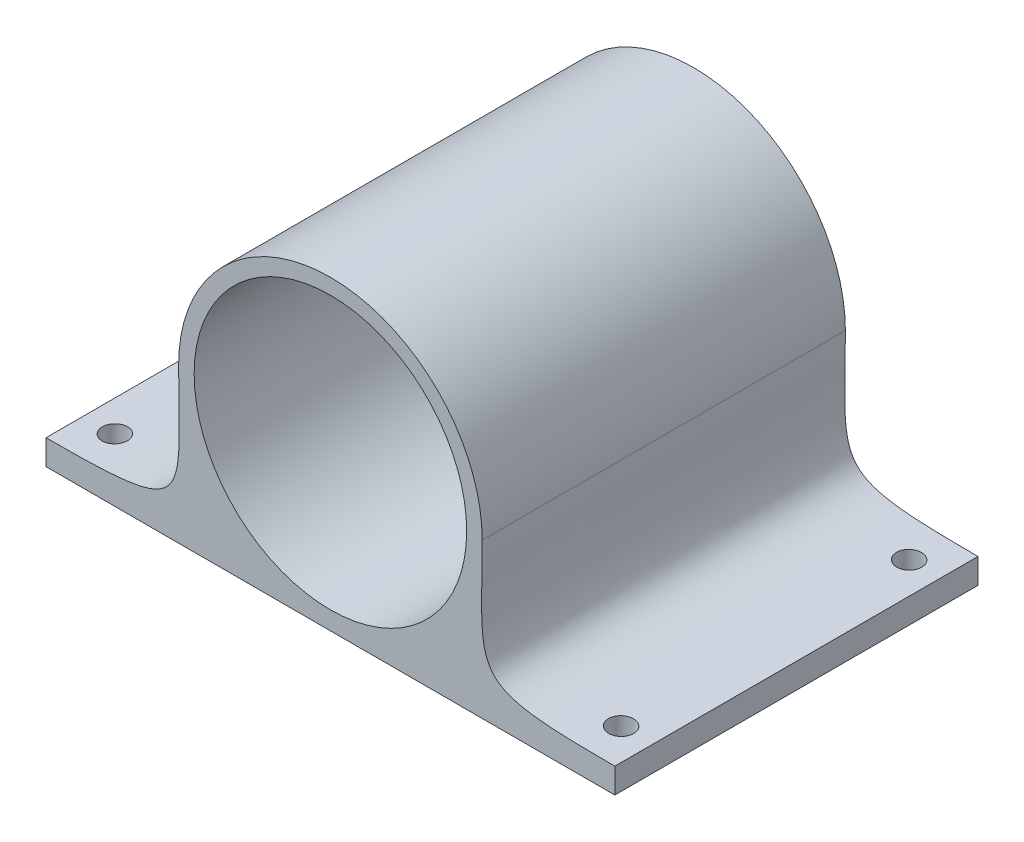
ISO-10303-21;
HEADER;
FILE_DESCRIPTION(('STEP AP214'),'2;1');
FILE_NAME('part.step','',(''),(''),'','','');
FILE_SCHEMA(('AUTOMOTIVE_DESIGN { 1 0 10303 214 1 1 1 1 }'));
ENDSEC;
DATA;
#1=APPLICATION_CONTEXT('core data for automotive mechanical design processes');
#2=APPLICATION_PROTOCOL_DEFINITION('international standard','automotive_design',2000,#1);
#3=PRODUCT_CONTEXT('',#1,'mechanical');
#4=PRODUCT('Part','Part','',(#3));
#5=PRODUCT_RELATED_PRODUCT_CATEGORY('part','',(#4));
#6=PRODUCT_DEFINITION_FORMATION('','',#4);
#7=PRODUCT_DEFINITION_CONTEXT('part definition',#1,'design');
#8=PRODUCT_DEFINITION('design','',#6,#7);
#9=PRODUCT_DEFINITION_SHAPE('','',#8);
#10=(LENGTH_UNIT() NAMED_UNIT(*) SI_UNIT(.MILLI.,.METRE.));
#11=(NAMED_UNIT(*) PLANE_ANGLE_UNIT() SI_UNIT($,.RADIAN.));
#12=(NAMED_UNIT(*) SI_UNIT($,.STERADIAN.) SOLID_ANGLE_UNIT());
#13=UNCERTAINTY_MEASURE_WITH_UNIT(LENGTH_MEASURE(1.E-05),#10,'distance_accuracy_value','');
#14=(GEOMETRIC_REPRESENTATION_CONTEXT(3) GLOBAL_UNCERTAINTY_ASSIGNED_CONTEXT((#13)) GLOBAL_UNIT_ASSIGNED_CONTEXT((#10,
#11,#12)) REPRESENTATION_CONTEXT('',''));
#15=CARTESIAN_POINT('',(0.,0.,0.));
#16=DIRECTION('',(0.,0.,1.));
#17=DIRECTION('',(1.,0.,0.));
#18=AXIS2_PLACEMENT_3D('',#15,#16,#17);
#19=CARTESIAN_POINT('',(0.,-24.6662459211709,58.));
#20=DIRECTION('',(0.,1.,0.));
#21=DIRECTION('',(0.,0.,1.));
#22=AXIS2_PLACEMENT_3D('',#19,#20,#21);
#23=PLANE('',#22);
#24=CARTESIAN_POINT('',(-40.4219408276064,-24.6662459211709,6.));
#25=DIRECTION('',(0.,1.,0.));
#26=DIRECTION('',(0.,0.,1.));
#27=AXIS2_PLACEMENT_3D('',#24,#25,#26);
#28=CIRCLE('',#27,2.);
#29=CARTESIAN_POINT('',(-40.4219408276064,-24.6662459211709,8.));
#30=VERTEX_POINT('',#29);
#31=EDGE_CURVE('E152',#30,#30,#28,.T.);
#32=ORIENTED_EDGE('',*,*,#31,.T.);
#33=EDGE_LOOP('',(#32));
#34=FACE_BOUND('',#33,.T.);
#35=CARTESIAN_POINT('',(40.4219408276064,-24.6662459211709,5.99999999999999));
#36=DIRECTION('',(0.,1.,0.));
#37=DIRECTION('',(0.,0.,1.));
#38=AXIS2_PLACEMENT_3D('',#35,#36,#37);
#39=CIRCLE('',#38,2.);
#40=CARTESIAN_POINT('',(40.4219408276064,-24.6662459211709,7.99999999999999));
#41=VERTEX_POINT('',#40);
#42=EDGE_CURVE('E149',#41,#41,#39,.F.);
#43=ORIENTED_EDGE('',*,*,#42,.F.);
#44=EDGE_LOOP('',(#43));
#45=FACE_BOUND('',#44,.T.);
#46=DIRECTION('',(1.,0.,0.));
#47=VECTOR('',#46,1.);
#48=CARTESIAN_POINT('',(0.,-24.6662459211709,0.));
#49=LINE('',#48,#47);
#50=CARTESIAN_POINT('',(-45.4219408276064,-24.6662459211709,0.));
#51=VERTEX_POINT('',#50);
#52=CARTESIAN_POINT('',(45.4219408276064,-24.6662459211709,0.));
#53=VERTEX_POINT('',#52);
#54=EDGE_CURVE('E112',#51,#53,#49,.T.);
#55=ORIENTED_EDGE('',*,*,#54,.T.);
#56=DIRECTION('',(0.,0.,-1.));
#57=VECTOR('',#56,1.);
#58=CARTESIAN_POINT('',(45.4219408276064,-24.6662459211709,58.));
#59=LINE('',#58,#57);
#60=CARTESIAN_POINT('',(45.4219408276064,-24.6662459211709,58.));
#61=VERTEX_POINT('',#60);
#62=EDGE_CURVE('E109',#61,#53,#59,.T.);
#63=ORIENTED_EDGE('',*,*,#62,.F.);
#64=DIRECTION('',(1.,0.,0.));
#65=VECTOR('',#64,1.);
#66=CARTESIAN_POINT('',(0.,-24.6662459211709,58.));
#67=LINE('',#66,#65);
#68=CARTESIAN_POINT('',(-45.4219408276064,-24.6662459211709,58.));
#69=VERTEX_POINT('',#68);
#70=EDGE_CURVE('E97',#69,#61,#67,.T.);
#71=ORIENTED_EDGE('',*,*,#70,.F.);
#72=DIRECTION('',(0.,0.,-1.));
#73=VECTOR('',#72,1.);
#74=CARTESIAN_POINT('',(-45.4219408276064,-24.6662459211709,58.));
#75=LINE('',#74,#73);
#76=EDGE_CURVE('E116',#69,#51,#75,.T.);
#77=ORIENTED_EDGE('',*,*,#76,.T.);
#78=EDGE_LOOP('',(#55,#63,#71,#77));
#79=FACE_BOUND('',#78,.T.);
#80=CARTESIAN_POINT('',(40.4219408276064,-24.6662459211709,52.));
#81=DIRECTION('',(0.,1.,0.));
#82=DIRECTION('',(0.,0.,1.));
#83=AXIS2_PLACEMENT_3D('',#80,#81,#82);
#84=CIRCLE('',#83,2.00601487558207);
#85=CARTESIAN_POINT('',(40.4219408276064,-24.6662459211709,54.0060148755821));
#86=VERTEX_POINT('',#85);
#87=EDGE_CURVE('E150',#86,#86,#84,.F.);
#88=ORIENTED_EDGE('',*,*,#87,.F.);
#89=EDGE_LOOP('',(#88));
#90=FACE_BOUND('',#89,.T.);
#91=CARTESIAN_POINT('',(-40.4219408276064,-24.6662459211709,52.));
#92=DIRECTION('',(0.,1.,0.));
#93=DIRECTION('',(0.,0.,1.));
#94=AXIS2_PLACEMENT_3D('',#91,#92,#93);
#95=CIRCLE('',#94,2.00601487558207);
#96=CARTESIAN_POINT('',(-40.4219408276064,-24.6662459211709,54.0060148755821));
#97=VERTEX_POINT('',#96);
#98=EDGE_CURVE('E222',#97,#97,#95,.T.);
#99=ORIENTED_EDGE('',*,*,#98,.T.);
#100=EDGE_LOOP('',(#99));
#101=FACE_BOUND('',#100,.T.);
#102=ADVANCED_FACE('F34',(#34,#45,#79,#90,#101),#23,.F.);
#103=CARTESIAN_POINT('',(45.4219408276064,-20.6662459211709,58.));
#104=CARTESIAN_POINT('',(21.5322033053492,-20.6662459211709,58.));
#105=CARTESIAN_POINT('',(24.2414756663066,-19.078845963853,58.));
#106=CARTESIAN_POINT('',(24.2414756663067,0.,58.));
#107=B_SPLINE_CURVE_WITH_KNOTS('',3,(#103,#104,#105,#106),.UNSPECIFIED.,.F.,.F.,(4,4),(0.,1.),.UNSPECIFIED.);
#108=DIRECTION('',(0.,0.,-1.));
#109=VECTOR('',#108,1.);
#110=SURFACE_OF_LINEAR_EXTRUSION('',#107,#109);
#111=CARTESIAN_POINT('',(45.4219408276064,-20.6662459211709,0.));
#112=CARTESIAN_POINT('',(21.5322033053492,-20.6662459211709,0.));
#113=CARTESIAN_POINT('',(24.2414756663066,-19.078845963853,0.));
#114=CARTESIAN_POINT('',(24.2414756663067,0.,0.));
#115=B_SPLINE_CURVE_WITH_KNOTS('',3,(#111,#112,#113,#114),.UNSPECIFIED.,.F.,.F.,(4,4),(0.,1.),.UNSPECIFIED.);
#116=CARTESIAN_POINT('',(45.4219408276064,-20.6662459211709,0.));
#117=VERTEX_POINT('',#116);
#118=CARTESIAN_POINT('',(24.2414756663067,0.,0.));
#119=VERTEX_POINT('',#118);
#120=EDGE_CURVE('E82',#117,#119,#115,.T.);
#121=ORIENTED_EDGE('',*,*,#120,.T.);
#122=DIRECTION('',(0.,0.,-1.));
#123=VECTOR('',#122,1.);
#124=CARTESIAN_POINT('',(24.2414756663067,0.,58.));
#125=LINE('',#124,#123);
#126=CARTESIAN_POINT('',(24.2414756663067,0.,58.));
#127=VERTEX_POINT('',#126);
#128=EDGE_CURVE('E120',#127,#119,#125,.T.);
#129=ORIENTED_EDGE('',*,*,#128,.F.);
#130=CARTESIAN_POINT('',(45.4219408276064,-20.6662459211709,58.));
#131=VERTEX_POINT('',#130);
#132=EDGE_CURVE('E57',#131,#127,#107,.T.);
#133=ORIENTED_EDGE('',*,*,#132,.F.);
#134=DIRECTION('',(0.,0.,-1.));
#135=VECTOR('',#134,1.);
#136=CARTESIAN_POINT('',(45.4219408276064,-20.6662459211709,58.));
#137=LINE('',#136,#135);
#138=EDGE_CURVE('E79',#131,#117,#137,.T.);
#139=ORIENTED_EDGE('',*,*,#138,.T.);
#140=EDGE_LOOP('',(#121,#129,#133,#139));
#141=FACE_BOUND('',#140,.T.);
#142=CARTESIAN_POINT('',(40.4219408276064,-20.6317382856228,7.99999999999999));
#143=CARTESIAN_POINT('',(40.5342790349699,-20.6336086290803,7.99999502249111));
#144=CARTESIAN_POINT('',(40.6467002286099,-20.6353787270249,7.9905033605227));
#145=CARTESIAN_POINT('',(40.8684496370192,-20.6386876994522,7.95276927023828));
#146=CARTESIAN_POINT('',(40.9777739744957,-20.6402262936494,7.92450433333279));
#147=CARTESIAN_POINT('',(41.1900849074258,-20.6430602528769,7.85002667215358));
#148=CARTESIAN_POINT('',(41.2930744666828,-20.6443557322422,7.80382241614786));
#149=CARTESIAN_POINT('',(41.4898073349953,-20.6467083637546,7.69478851274403));
#150=CARTESIAN_POINT('',(41.5835529305602,-20.6477655749213,7.6319629908748));
#151=CARTESIAN_POINT('',(41.7591709398412,-20.649656334208,7.49146262590645));
#152=CARTESIAN_POINT('',(41.8410430633063,-20.6504898768608,7.41378741990929));
#153=CARTESIAN_POINT('',(41.9905882271936,-20.6519523214478,7.24579001210443));
#154=CARTESIAN_POINT('',(42.0582607156949,-20.6525812154281,7.15546731893323));
#155=CARTESIAN_POINT('',(42.1774768853148,-20.6536541263953,6.96474805763309));
#156=CARTESIAN_POINT('',(42.2290216698837,-20.6540981560312,6.8643521793279));
#157=CARTESIAN_POINT('',(42.3145249670873,-20.6548187069021,6.65633155595461));
#158=CARTESIAN_POINT('',(42.3484835166343,-20.6550952284888,6.54870682605987));
#159=CARTESIAN_POINT('',(42.3978499833641,-20.6554931082411,6.32928497295178));
#160=CARTESIAN_POINT('',(42.4132581390924,-20.6556144684019,6.21748790341096));
#161=CARTESIAN_POINT('',(42.4250871230456,-20.6557078641429,5.99289387562374));
#162=CARTESIAN_POINT('',(42.4215079858603,-20.655679899995,5.88009691919925));
#163=CARTESIAN_POINT('',(42.3954641162226,-20.6554732807726,5.65670517386504));
#164=CARTESIAN_POINT('',(42.37299942895,-20.6552946260586,5.54611037968777));
#165=CARTESIAN_POINT('',(42.3098223167248,-20.6547782175756,5.33026202104121));
#166=CARTESIAN_POINT('',(42.2691098730028,-20.6544404636428,5.22500846206597));
#167=CARTESIAN_POINT('',(42.1705931746239,-20.6535914157975,5.02283043978747));
#168=CARTESIAN_POINT('',(42.1127889086491,-20.6530801217701,4.92590598199969));
#169=CARTESIAN_POINT('',(41.981729925504,-20.651865402409,4.74313757677469));
#170=CARTESIAN_POINT('',(41.9084752151785,-20.6511619771605,4.65729362442869));
#171=CARTESIAN_POINT('',(41.7485947447748,-20.6495430160419,4.49912209476095));
#172=CARTESIAN_POINT('',(41.6619688736682,-20.6486274784106,4.42679462968532));
#173=CARTESIAN_POINT('',(41.4778063385321,-20.6465665700805,4.29770956433603));
#174=CARTESIAN_POINT('',(41.380269672844,-20.6454211993468,4.2409519664293));
#175=CARTESIAN_POINT('',(41.1770517526185,-20.6428894606081,4.14461527672764));
#176=CARTESIAN_POINT('',(41.0713702332482,-20.6415030847649,4.10503674379422));
#177=CARTESIAN_POINT('',(40.8548660055108,-20.6384896405975,4.04418300338992));
#178=CARTESIAN_POINT('',(40.7440432956723,-20.6368625722045,4.02290780115779));
#179=CARTESIAN_POINT('',(40.5203929225547,-20.6333840409432,3.99926190336419));
#180=CARTESIAN_POINT('',(40.407565086996,-20.6315325587131,3.9968928401591));
#181=CARTESIAN_POINT('',(40.1831161659412,-20.627641998031,4.01112900906305));
#182=CARTESIAN_POINT('',(40.0714950815904,-20.6256029194011,4.02773425917967));
#183=CARTESIAN_POINT('',(39.8526107215316,-20.6213963024097,4.07945025814166));
#184=CARTESIAN_POINT('',(39.7453480880716,-20.6192287452309,4.11456372372603));
#185=CARTESIAN_POINT('',(39.5382414871035,-20.6148478054737,4.20230057079528));
#186=CARTESIAN_POINT('',(39.4383975269135,-20.6126344228501,4.25492396955209));
#187=CARTESIAN_POINT('',(39.2489494121442,-20.6082638150437,4.37619520468291));
#188=CARTESIAN_POINT('',(39.1593465231056,-20.6061065968268,4.44484501833901));
#189=CARTESIAN_POINT('',(38.9929383049359,-20.6019643026561,4.59621826047856));
#190=CARTESIAN_POINT('',(38.916132980814,-20.5999792267696,4.67894169447051));
#191=CARTESIAN_POINT('',(38.7775064428388,-20.5963007294066,4.85610924265601));
#192=CARTESIAN_POINT('',(38.7156841760157,-20.5946072874371,4.95055253250324));
#193=CARTESIAN_POINT('',(38.6087744471177,-20.5916229204034,5.14848415347149));
#194=CARTESIAN_POINT('',(38.563686934008,-20.5903319941116,5.25197245700733));
#195=CARTESIAN_POINT('',(38.4915416077108,-20.5882430719071,5.46502029945219));
#196=CARTESIAN_POINT('',(38.4644778618602,-20.5874449138022,5.57457782775432));
#197=CARTESIAN_POINT('',(38.4291267829117,-20.586398794549,5.79668411805912));
#198=CARTESIAN_POINT('',(38.4208394393846,-20.586150833095,5.90923287840031));
#199=CARTESIAN_POINT('',(38.4232767813268,-20.5862234405252,6.13408536745062));
#200=CARTESIAN_POINT('',(38.4339949446052,-20.5865438143717,6.24638916698235));
#201=CARTESIAN_POINT('',(38.4741255719203,-20.5877290548033,6.46760261112082));
#202=CARTESIAN_POINT('',(38.5035380695955,-20.5885939223683,6.57651224961976));
#203=CARTESIAN_POINT('',(38.5802212806556,-20.5908056812206,6.7878484987662));
#204=CARTESIAN_POINT('',(38.6274923077938,-20.5921525809766,6.89027499547567));
#205=CARTESIAN_POINT('',(38.7385472503289,-20.5952351125406,7.0857347078754));
#206=CARTESIAN_POINT('',(38.8023305499426,-20.596970729852,7.17876827367124));
#207=CARTESIAN_POINT('',(38.9446161502273,-20.6007185976101,7.35283080304864));
#208=CARTESIAN_POINT('',(39.0231219091885,-20.6027309130233,7.4338569380753));
#209=CARTESIAN_POINT('',(39.1926403045412,-20.6069130940904,7.58160126940743));
#210=CARTESIAN_POINT('',(39.2836560634235,-20.6090829990147,7.64831588288392));
#211=CARTESIAN_POINT('',(39.4756606672116,-20.6134670652993,7.76556593882708));
#212=CARTESIAN_POINT('',(39.5766574947598,-20.6156812609352,7.81608829180362));
#213=CARTESIAN_POINT('',(39.7856222154777,-20.6200502072773,7.89940033387875));
#214=CARTESIAN_POINT('',(39.8935815930627,-20.6222050261656,7.93221124131328));
#215=CARTESIAN_POINT('',(40.0721796215504,-20.6255946127958,7.97043648091869));
#216=CARTESIAN_POINT('',(40.1416573509716,-20.6268717862987,7.98150884628825));
#217=CARTESIAN_POINT('',(40.2813928329537,-20.6293584838863,7.9962921634122));
#218=CARTESIAN_POINT('',(40.3516505855918,-20.6305680079643,8.0000031144373));
#219=CARTESIAN_POINT('',(40.4219408276064,-20.6317382856228,7.99999999999999));
#220=B_SPLINE_CURVE_WITH_KNOTS('',3,(#142,#143,#144,#145,#146,#147,#148,#149,#150,#151,#152,
#153,#154,#155,#156,#157,#158,#159,#160,#161,#162,#163,#164,#165,#166,#167,#168,#169,#170,#171,
#172,#173,#174,#175,#176,#177,#178,#179,#180,#181,#182,#183,#184,#185,#186,#187,#188,#189,#190,
#191,#192,#193,#194,#195,#196,#197,#198,#199,#200,#201,#202,#203,#204,#205,#206,#207,#208,#209,
#210,#211,#212,#213,#214,#215,#216,#217,#218,#219),.UNSPECIFIED.,.T.,.F.,(4,2,2,2,2,2,2,2,2,2,2,
2,2,2,2,2,2,2,2,2,2,2,2,2,2,2,2,2,2,2,2,2,2,2,2,2,2,2,4),(0.,0.336804791421051,
0.674014132332997,1.01106448649586,1.34803126047007,1.68500627032419,2.02199437552142,
2.35895941910126,2.69592375541368,3.03288375854657,3.36984314782956,3.70680173101224,
4.04376066078757,4.38071981369305,4.71767881732179,5.05464061906356,5.39160247203015,
5.72857528606443,6.06554819654646,6.40255020096082,6.73955252520745,7.0766043303146,
7.41365646789349,7.75075021176443,8.08784408757634,8.42491426644535,8.76198341736473,
9.09894156444117,9.43589952435766,9.77274187152699,10.109584824809,10.4464336962978,
10.7832700076773,11.1201855408869,11.4571853212991,11.7944568422646,12.1313234096737,
12.342062823368,12.5528022579403),.UNSPECIFIED.);
#221=CARTESIAN_POINT('',(40.4219408276064,-20.6317382856228,7.99999999999999));
#222=VERTEX_POINT('',#221);
#223=EDGE_CURVE('E143',#222,#222,#220,.T.);
#224=ORIENTED_EDGE('',*,*,#223,.F.);
#225=EDGE_LOOP('',(#224));
#226=FACE_BOUND('',#225,.T.);
#227=CARTESIAN_POINT('',(40.4219408276064,-20.6317382856228,54.0060148755821));
#228=CARTESIAN_POINT('',(40.5346168384077,-20.6336142529384,54.0060098831142));
#229=CARTESIAN_POINT('',(40.6473760893819,-20.6353893670841,53.9964896834372));
#230=CARTESIAN_POINT('',(40.8697923191343,-20.6387071729534,53.9586421377771));
#231=CARTESIAN_POINT('',(40.9794454090117,-20.6402495829473,53.9302922157605));
#232=CARTESIAN_POINT('',(41.1923947948439,-20.6430900884209,53.8555906172896));
#233=CARTESIAN_POINT('',(41.2956940634959,-20.6443882987459,53.8092474345212));
#234=CARTESIAN_POINT('',(41.4930185514019,-20.6467454858127,53.6998856866684));
#235=CARTESIAN_POINT('',(41.5870460640038,-20.6478045217977,53.6368712594528));
#236=CARTESIAN_POINT('',(41.7631922143472,-20.6496982290773,53.4959484292384));
#237=CARTESIAN_POINT('',(41.8453105601771,-20.6505328948726,53.4180396612651));
#238=CARTESIAN_POINT('',(41.995305475297,-20.6519970853224,53.2495371002211));
#239=CARTESIAN_POINT('',(42.0631814909991,-20.6526266020034,53.1589428143026));
#240=CARTESIAN_POINT('',(42.1827562359079,-20.6537004366909,52.9676500497271));
#241=CARTESIAN_POINT('',(42.2344560676832,-20.6541447673204,52.866952260343));
#242=CARTESIAN_POINT('',(42.3202165738842,-20.6548657397656,52.6583060718143));
#243=CARTESIAN_POINT('',(42.3542772853118,-20.655142381933,52.55035768788));
#244=CARTESIAN_POINT('',(42.4037922951684,-20.6555404174968,52.3302759532665));
#245=CARTESIAN_POINT('',(42.4192468293398,-20.6556618128603,52.2181426556293));
#246=CARTESIAN_POINT('',(42.4311114638263,-20.6557552370606,51.9928731583773));
#247=CARTESIAN_POINT('',(42.4275215988244,-20.6557272661695,51.8797369605895));
#248=CARTESIAN_POINT('',(42.4013994710542,-20.6555205814033,51.6556733410894));
#249=CARTESIAN_POINT('',(42.378867252253,-20.655341867878,51.544745914251));
#250=CARTESIAN_POINT('',(42.3155001895408,-20.654825226457,51.3282483486012));
#251=CARTESIAN_POINT('',(42.2746653268021,-20.6544872983976,51.222678215301));
#252=CARTESIAN_POINT('',(42.1758523793015,-20.6536376737386,51.0198920931776));
#253=CARTESIAN_POINT('',(42.1178742837087,-20.6531259770294,50.9226761096325));
#254=CARTESIAN_POINT('',(41.9864211647116,-20.6519100669774,50.7393579750281));
#255=CARTESIAN_POINT('',(41.9129461481811,-20.65120585372,50.6532558190392));
#256=CARTESIAN_POINT('',(41.752584853508,-20.6495847421157,50.4946085443268));
#257=CARTESIAN_POINT('',(41.6656984659158,-20.6486678420332,50.4220635362532));
#258=CARTESIAN_POINT('',(41.4809820776894,-20.6466034293172,50.2925902104814));
#259=CARTESIAN_POINT('',(41.3831520754091,-20.6454559166491,50.2356618951321));
#260=CARTESIAN_POINT('',(41.1793230088925,-20.6429189174483,50.1390354485739));
#261=CARTESIAN_POINT('',(41.0733236810671,-20.6415294231062,50.0993378736013));
#262=CARTESIAN_POINT('',(40.8561683765921,-20.6385086051862,50.0383010896329));
#263=CARTESIAN_POINT('',(40.745012398477,-20.6368772815397,50.0169618858546));
#264=CARTESIAN_POINT('',(40.5206894856459,-20.6333890147318,49.9932448339362));
#265=CARTESIAN_POINT('',(40.4075223785229,-20.6315320521466,49.9908686193617));
#266=CARTESIAN_POINT('',(40.1823985485745,-20.627629324562,50.0051475304209));
#267=CARTESIAN_POINT('',(40.0704418268985,-20.6255835593833,50.0218026741249));
#268=CARTESIAN_POINT('',(39.8508992771737,-20.6213625179693,50.0736740955687));
#269=CARTESIAN_POINT('',(39.7433140941776,-20.6191872227367,50.1088931019069));
#270=CARTESIAN_POINT('',(39.5355847006503,-20.614790068504,50.1968936704994));
#271=CARTESIAN_POINT('',(39.4354404974966,-20.6125682094577,50.2496752501661));
#272=CARTESIAN_POINT('',(39.2454226128546,-20.6081803727436,50.3713110625274));
#273=CARTESIAN_POINT('',(39.1555502076631,-20.606014402046,50.4401672893102));
#274=CARTESIAN_POINT('',(38.9886414376596,-20.6018549191517,50.5919956911206));
#275=CARTESIAN_POINT('',(38.911605077925,-20.5998614070231,50.6749678717316));
#276=CARTESIAN_POINT('',(38.7725614939053,-20.5961670110853,50.8526682157071));
#277=CARTESIAN_POINT('',(38.7105532197404,-20.5944661068366,50.9473955571427));
#278=CARTESIAN_POINT('',(38.6033218143467,-20.5914684361207,51.1459225136842));
#279=CARTESIAN_POINT('',(38.558098631843,-20.5901716684191,51.2497221010752));
#280=CARTESIAN_POINT('',(38.4857362360544,-20.5880732315375,51.4634107185913));
#281=CARTESIAN_POINT('',(38.4585910588268,-20.5872713990844,51.5732977275015));
#282=CARTESIAN_POINT('',(38.4231335865726,-20.5862204536937,51.7960719895174));
#283=CARTESIAN_POINT('',(38.4148212809173,-20.5859713404441,51.9089592409296));
#284=CARTESIAN_POINT('',(38.4172658784541,-20.586044281732,52.1344878399589));
#285=CARTESIAN_POINT('',(38.4280162161467,-20.5863661396173,52.247129258867));
#286=CARTESIAN_POINT('',(38.468267369459,-20.5875568345278,52.4690077427325));
#287=CARTESIAN_POINT('',(38.4977682188243,-20.5884256725374,52.5782448015625));
#288=CARTESIAN_POINT('',(38.5746817936617,-20.5906474729966,52.7902164103363));
#289=CARTESIAN_POINT('',(38.6220948337871,-20.5920004439507,52.8929508460151));
#290=CARTESIAN_POINT('',(38.7334834187997,-20.595096657329,53.0889982187904));
#291=CARTESIAN_POINT('',(38.7974583461887,-20.5968398852024,53.1823115069673));
#292=CARTESIAN_POINT('',(38.9401715221943,-20.6006038670375,53.3568975356429));
#293=CARTESIAN_POINT('',(39.0189132577707,-20.6026246865179,53.4381674241427));
#294=CARTESIAN_POINT('',(39.1889412310823,-20.6068241157719,53.5863562577309));
#295=CARTESIAN_POINT('',(39.2802306007279,-20.6090027648755,53.6532716091913));
#296=CARTESIAN_POINT('',(39.4728125147902,-20.6134039893165,53.7708745533827));
#297=CARTESIAN_POINT('',(39.5741130732618,-20.6156265986874,53.8215490051678));
#298=CARTESIAN_POINT('',(39.7837062632211,-20.620011578026,53.9051119078096));
#299=CARTESIAN_POINT('',(39.8919903535035,-20.6221740171173,53.9380216407249));
#300=CARTESIAN_POINT('',(40.0711258985278,-20.6255751159972,53.9763621329022));
#301=CARTESIAN_POINT('',(40.1408129347843,-20.6268565111338,53.9874679145591));
#302=CARTESIAN_POINT('',(40.2809693934604,-20.6293511943167,54.0022958481716));
#303=CARTESIAN_POINT('',(40.3514388159572,-20.6305644823562,54.0060179993972));
#304=CARTESIAN_POINT('',(40.4219408276064,-20.6317382856228,54.0060148755821));
#305=B_SPLINE_CURVE_WITH_KNOTS('',3,(#227,#228,#229,#230,#231,#232,#233,#234,#235,#236,#237,
#238,#239,#240,#241,#242,#243,#244,#245,#246,#247,#248,#249,#250,#251,#252,#253,#254,#255,#256,
#257,#258,#259,#260,#261,#262,#263,#264,#265,#266,#267,#268,#269,#270,#271,#272,#273,#274,#275,
#276,#277,#278,#279,#280,#281,#282,#283,#284,#285,#286,#287,#288,#289,#290,#291,#292,#293,#294,
#295,#296,#297,#298,#299,#300,#301,#302,#303,#304),.UNSPECIFIED.,.T.,.F.,(4,2,2,2,2,2,2,2,2,2,2,
2,2,2,2,2,2,2,2,2,2,2,2,2,2,2,2,2,2,2,2,2,2,2,2,2,2,2,4),(0.,0.337817569372954,
0.676040900498629,1.01410476764886,1.35208480460226,1.69007312455634,2.02807457941188,
2.36605299106705,2.70403069373437,3.04200411414168,3.37997691904575,3.71794893948211,
4.05592130758782,4.39389388922137,4.73186632094441,5.06984151098916,5.40781675186768,
5.74580290232412,6.08378914883377,6.42180451083385,6.75982019378253,7.09788557362775,
7.43595128864751,7.77405896361991,8.11216677233047,8.4502509536165,8.78833410212201,
9.12630566151008,9.46427703015516,9.80213201830568,10.1399876145022,10.4778491458927,
10.815698082171,11.1536268970795,11.4916402132738,11.8299263386157,12.1678062940761,
12.3791806202241,12.5905549672734),.UNSPECIFIED.);
#306=CARTESIAN_POINT('',(40.4219408276064,-20.6317382856228,54.0060148755821));
#307=VERTEX_POINT('',#306);
#308=EDGE_CURVE('E38',#307,#307,#305,.T.);
#309=ORIENTED_EDGE('',*,*,#308,.F.);
#310=EDGE_LOOP('',(#309));
#311=FACE_BOUND('',#310,.T.);
#312=ADVANCED_FACE('F132',(#141,#226,#311),#110,.F.);
#313=CARTESIAN_POINT('',(0.,0.,58.));
#314=DIRECTION('',(0.,0.,-1.));
#315=DIRECTION('',(-1.,0.,0.));
#316=AXIS2_PLACEMENT_3D('',#313,#314,#315);
#317=CYLINDRICAL_SURFACE('',#316,24.2414756663067);
#318=CARTESIAN_POINT('',(0.,0.,0.));
#319=DIRECTION('',(0.,0.,1.));
#320=DIRECTION('',(1.,0.,0.));
#321=AXIS2_PLACEMENT_3D('',#318,#319,#320);
#322=CIRCLE('',#321,24.2414756663067);
#323=CARTESIAN_POINT('',(-24.2414756663067,0.,0.));
#324=VERTEX_POINT('',#323);
#325=EDGE_CURVE('E127',#119,#324,#322,.T.);
#326=ORIENTED_EDGE('',*,*,#325,.T.);
#327=DIRECTION('',(0.,0.,-1.));
#328=VECTOR('',#327,1.);
#329=CARTESIAN_POINT('',(-24.2414756663067,0.,58.));
#330=LINE('',#329,#328);
#331=CARTESIAN_POINT('',(-24.2414756663067,0.,58.));
#332=VERTEX_POINT('',#331);
#333=EDGE_CURVE('E48',#332,#324,#330,.T.);
#334=ORIENTED_EDGE('',*,*,#333,.F.);
#335=CARTESIAN_POINT('',(0.,0.,58.));
#336=DIRECTION('',(0.,0.,1.));
#337=DIRECTION('',(1.,0.,0.));
#338=AXIS2_PLACEMENT_3D('',#335,#336,#337);
#339=CIRCLE('',#338,24.2414756663067);
#340=EDGE_CURVE('E88',#127,#332,#339,.T.);
#341=ORIENTED_EDGE('',*,*,#340,.F.);
#342=ORIENTED_EDGE('',*,*,#128,.T.);
#343=EDGE_LOOP('',(#326,#334,#341,#342));
#344=FACE_BOUND('',#343,.T.);
#345=ADVANCED_FACE('F137',(#344),#317,.T.);
#346=CARTESIAN_POINT('',(-45.4219408276064,-20.6662459211709,58.));
#347=CARTESIAN_POINT('',(-21.5322033053492,-20.6662459211709,58.));
#348=CARTESIAN_POINT('',(-24.2414756663066,-19.078845963853,58.));
#349=CARTESIAN_POINT('',(-24.2414756663067,0.,58.));
#350=B_SPLINE_CURVE_WITH_KNOTS('',3,(#346,#347,#348,#349),.UNSPECIFIED.,.F.,.F.,(4,4),(0.,1.),.UNSPECIFIED.);
#351=DIRECTION('',(0.,0.,-1.));
#352=VECTOR('',#351,1.);
#353=SURFACE_OF_LINEAR_EXTRUSION('',#350,#352);
#354=CARTESIAN_POINT('',(-40.4219408276064,-20.6317382856228,54.0060148755821));
#355=CARTESIAN_POINT('',(-40.3092409617379,-20.6298616417962,54.0060098779024));
#356=CARTESIAN_POINT('',(-40.196461099887,-20.627881354975,53.9964856289145));
#357=CARTESIAN_POINT('',(-39.9740112114932,-20.6237646525165,53.958625321665));
#358=CARTESIAN_POINT('',(-39.8643450960567,-20.6216280516195,53.9302666090271));
#359=CARTESIAN_POINT('',(-39.6513774595423,-20.6172754646096,53.8555458716493));
#360=CARTESIAN_POINT('',(-39.5480728996162,-20.6150595172124,53.8091925212758));
#361=CARTESIAN_POINT('',(-39.3507421253501,-20.6106438494207,53.6998099762825));
#362=CARTESIAN_POINT('',(-39.2567136158834,-20.6084441251375,53.6367849209383));
#363=CARTESIAN_POINT('',(-39.0805556620327,-20.604172092213,53.4958301390885));
#364=CARTESIAN_POINT('',(-38.9984281112905,-20.602099803879,53.4178980451903));
#365=CARTESIAN_POINT('',(-38.8484201647594,-20.5982029155596,53.249342785414));
#366=CARTESIAN_POINT('',(-38.7805403194455,-20.5963783251452,53.1587191294097));
#367=CARTESIAN_POINT('',(-38.660971383842,-20.5930935490693,52.96737151656));
#368=CARTESIAN_POINT('',(-38.6092794494582,-20.591633299405,52.866649338059));
#369=CARTESIAN_POINT('',(-38.5235407016839,-20.5891767311584,52.6579506872695));
#370=CARTESIAN_POINT('',(-38.4894938104978,-20.5881804105307,52.5499742469669));
#371=CARTESIAN_POINT('',(-38.4400235300011,-20.5867235274234,52.3298750228926));
#372=CARTESIAN_POINT('',(-38.4245932111239,-20.5862627655973,52.2177537979427));
#373=CARTESIAN_POINT('',(-38.4127723500348,-20.58591030569,51.9925115399337));
#374=CARTESIAN_POINT('',(-38.4163817374734,-20.5860186055062,51.8793905105704));
#375=CARTESIAN_POINT('',(-38.4425338449652,-20.5867961229202,51.6553911278716));
#376=CARTESIAN_POINT('',(-38.4650715573996,-20.5874651921626,51.5445121893201));
#377=CARTESIAN_POINT('',(-38.5284324766143,-20.5893151229683,51.3281125854791));
#378=CARTESIAN_POINT('',(-38.5692557138889,-20.5904959853851,51.2225919291258));
#379=CARTESIAN_POINT('',(-38.6680335787063,-20.5932862900241,51.0198887240815));
#380=CARTESIAN_POINT('',(-38.7259904117737,-20.5948957874197,50.9227072509323));
#381=CARTESIAN_POINT('',(-38.8573874023417,-20.5984358680406,50.739452415252));
#382=CARTESIAN_POINT('',(-38.9308275869764,-20.6003664518286,50.653379072188));
#383=CARTESIAN_POINT('',(-39.0911381483395,-20.6044305652969,50.4947490395476));
#384=CARTESIAN_POINT('',(-39.1780136200763,-20.6065641718502,50.422197500902));
#385=CARTESIAN_POINT('',(-39.3627094856094,-20.6109155601769,50.2927083725978));
#386=CARTESIAN_POINT('',(-39.4605298975798,-20.61313334209,50.2357708088668));
#387=CARTESIAN_POINT('',(-39.6643676814377,-20.6175468689957,50.13911174878));
#388=CARTESIAN_POINT('',(-39.7703871820374,-20.6197426080971,50.0993947411631));
#389=CARTESIAN_POINT('',(-39.9875920044153,-20.6240233415733,50.0383263263196));
#390=CARTESIAN_POINT('',(-40.0987773264499,-20.6261083359426,50.0169749200042));
#391=CARTESIAN_POINT('',(-40.3231570366597,-20.6301020755926,49.993245235579));
#392=CARTESIAN_POINT('',(-40.4363514124526,-20.632010821959,49.9908668405744));
#393=CARTESIAN_POINT('',(-40.6615356883028,-20.6356097991282,50.0051521457517));
#394=CARTESIAN_POINT('',(-40.7735255891604,-20.637300030076,50.0218158332807));
#395=CARTESIAN_POINT('',(-40.9931038777376,-20.640440644559,50.0737099126708));
#396=CARTESIAN_POINT('',(-41.1006929075579,-20.641891063178,50.1089375855018));
#397=CARTESIAN_POINT('',(-41.3084310414984,-20.6445486304826,50.1969591016779));
#398=CARTESIAN_POINT('',(-41.4085801518103,-20.6457557793707,50.2497529304036));
#399=CARTESIAN_POINT('',(-41.5985810706083,-20.6479356091702,50.3714004855455));
#400=CARTESIAN_POINT('',(-41.6884342338167,-20.648908320947,50.4402520954805));
#401=CARTESIAN_POINT('',(-41.8553066797782,-20.6506362097337,50.5920648504933));
#402=CARTESIAN_POINT('',(-41.9323259622692,-20.6513913867392,50.6750259958592));
#403=CARTESIAN_POINT('',(-42.0713385726534,-20.6527041472056,50.8526967386681));
#404=CARTESIAN_POINT('',(-42.1333329007698,-20.6532617438208,50.9474055534244));
#405=CARTESIAN_POINT('',(-42.2405418003513,-20.6541988076876,51.1458873846323));
#406=CARTESIAN_POINT('',(-42.2857563918247,-20.6545782751516,51.2496603902755));
#407=CARTESIAN_POINT('',(-42.3581212170057,-20.655174880606,51.4633223306165));
#408=CARTESIAN_POINT('',(-42.3852718604218,-20.6553920222781,51.5732111265408));
#409=CARTESIAN_POINT('',(-42.4207395800675,-20.6556740981496,51.7959875665082));
#410=CARTESIAN_POINT('',(-42.4290566230576,-20.6557390320803,51.9088752158436));
#411=CARTESIAN_POINT('',(-42.4266209125352,-20.6557198758704,52.134443814529));
#412=CARTESIAN_POINT('',(-42.4158682884219,-20.655635786741,52.2471247652763));
#413=CARTESIAN_POINT('',(-42.3755987282937,-20.6553144769619,52.4690822843084));
#414=CARTESIAN_POINT('',(-42.3460817549881,-20.6550772560078,52.578358845827));
#415=CARTESIAN_POINT('',(-42.2691208897806,-20.6544387541083,52.7904072839293));
#416=CARTESIAN_POINT('',(-42.2216766649226,-20.6540374701156,52.8931790396601));
#417=CARTESIAN_POINT('',(-42.1102104239671,-20.6530544551643,53.0892943697209));
#418=CARTESIAN_POINT('',(-42.0461890586574,-20.6524727312892,53.1826383139694));
#419=CARTESIAN_POINT('',(-41.9033936765135,-20.6511092651676,53.3572442672065));
#420=CARTESIAN_POINT('',(-41.8246211326377,-20.650327542889,53.4385074810474));
#421=CARTESIAN_POINT('',(-41.6545303485418,-20.64854397593,53.5866760949235));
#422=CARTESIAN_POINT('',(-41.5632089984181,-20.6475420766474,53.6535779252904));
#423=CARTESIAN_POINT('',(-41.3705956635691,-20.6453019587628,53.7711271071032));
#424=CARTESIAN_POINT('',(-41.2692987271431,-20.6440636225084,53.8217663324035));
#425=CARTESIAN_POINT('',(-41.0597236247556,-20.6413440497301,53.9052619592187));
#426=CARTESIAN_POINT('',(-40.9514539927291,-20.6398631068301,53.9381396530948));
#427=CARTESIAN_POINT('',(-40.7724027498979,-20.6372656326652,53.9764223181532));
#428=CARTESIAN_POINT('',(-40.7027830722991,-20.6362206111423,53.9875057814676));
#429=CARTESIAN_POINT('',(-40.5627662857721,-20.6340433133251,54.0023036215732));
#430=CARTESIAN_POINT('',(-40.4923691768824,-20.6329110370353,54.0060179987298));
#431=CARTESIAN_POINT('',(-40.4219408276064,-20.6317382856228,54.0060148755821));
#432=B_SPLINE_CURVE_WITH_KNOTS('',3,(#354,#355,#356,#357,#358,#359,#360,#361,#362,#363,#364,
#365,#366,#367,#368,#369,#370,#371,#372,#373,#374,#375,#376,#377,#378,#379,#380,#381,#382,#383,
#384,#385,#386,#387,#388,#389,#390,#391,#392,#393,#394,#395,#396,#397,#398,#399,#400,#401,#402,
#403,#404,#405,#406,#407,#408,#409,#410,#411,#412,#413,#414,#415,#416,#417,#418,#419,#420,#421,
#422,#423,#424,#425,#426,#427,#428,#429,#430,#431),.UNSPECIFIED.,.T.,.F.,(4,2,2,2,2,2,2,2,2,2,2,
2,2,2,2,2,2,2,2,2,2,2,2,2,2,2,2,2,2,2,2,2,2,2,2,2,2,2,4),(0.,0.337889338836491,
0.676185833886582,1.01431945424416,1.35236920095367,1.69047267811324,2.02858921584675,
2.36664631567465,2.7047019250216,3.04263166252375,3.38056015141965,3.71839926715869,
4.05623894630476,4.39412213286306,4.73200591155497,5.07001814015235,5.40803093002911,
5.74613177399494,6.08423263473844,6.42233141240515,6.76042996541698,7.0984790115629,
7.43652777636969,7.77453201012426,8.11253625078317,8.45051798404354,8.78849931429081,
9.12647297852196,9.46444723924235,9.80241920661027,10.1403918456376,10.4783707620118,
10.8163364119679,11.154268332811,11.4922841530634,11.8304686121868,12.1682467541461,
12.379400417631,12.5905540706442),.UNSPECIFIED.);
#433=CARTESIAN_POINT('',(-40.4219408276064,-20.6317382856228,54.0060148755821));
#434=VERTEX_POINT('',#433);
#435=EDGE_CURVE('E224',#434,#434,#432,.T.);
#436=ORIENTED_EDGE('',*,*,#435,.F.);
#437=EDGE_LOOP('',(#436));
#438=FACE_BOUND('',#437,.T.);
#439=CARTESIAN_POINT('',(-40.4219408276064,-20.6317382856228,8.));
#440=CARTESIAN_POINT('',(-40.3095789002013,-20.6298672695112,7.99999501731153));
#441=CARTESIAN_POINT('',(-40.1971372112656,-20.627893226819,7.99049932895658));
#442=CARTESIAN_POINT('',(-39.9753543301359,-20.6237901448001,7.95275254814896));
#443=CARTESIAN_POINT('',(-39.8660170373142,-20.6216609215687,7.92447886919202));
#444=CARTESIAN_POINT('',(-39.6536879472632,-20.6173239614372,7.84998217225477));
#445=CARTESIAN_POINT('',(-39.5506931204773,-20.6151162628293,7.8037678021385));
#446=CARTESIAN_POINT('',(-39.3539539879607,-20.610717554804,7.69471320714812));
#447=CARTESIAN_POINT('',(-39.2602073939387,-20.6085265413826,7.63187710922711));
#448=CARTESIAN_POINT('',(-39.0845776426571,-20.6042718490029,7.49134495955263));
#449=CARTESIAN_POINT('',(-39.0026963672539,-20.6022081902729,7.41364655513982));
#450=CARTESIAN_POINT('',(-38.8531382489354,-20.598327836994,7.24559673809526));
#451=CARTESIAN_POINT('',(-38.7854619548266,-20.5965111519878,7.15524483682306));
#452=CARTESIAN_POINT('',(-38.6662515766223,-20.5932407998267,6.96447104520831));
#453=CARTESIAN_POINT('',(-38.6147146552302,-20.5917870688738,6.86405092895729));
#454=CARTESIAN_POINT('',(-38.5292330101895,-20.5893415591611,6.65597817312404));
#455=CARTESIAN_POINT('',(-38.495288209113,-20.5883497783681,6.54832556537638));
#456=CARTESIAN_POINT('',(-38.445966217423,-20.5868995566984,6.32888633360894));
#457=CARTESIAN_POINT('',(-38.4305821378365,-20.5864409179436,6.21710125927692));
#458=CARTESIAN_POINT('',(-38.418796678131,-20.586090080067,5.99253429892294));
#459=CARTESIAN_POINT('',(-38.4223952280071,-20.5861978788562,5.87975241657858));
#460=CARTESIAN_POINT('',(-38.4484689175262,-20.5869718211195,5.65642448283855));
#461=CARTESIAN_POINT('',(-38.4709390836619,-20.5876378174838,5.54587785021559));
#462=CARTESIAN_POINT('',(-38.534110138661,-20.5894793332537,5.33012679739516));
#463=CARTESIAN_POINT('',(-38.574811057859,-20.590654853507,5.22492238608703));
#464=CARTESIAN_POINT('',(-38.6732929510982,-20.5934327074488,5.0228267417768));
#465=CARTESIAN_POINT('',(-38.7310761152859,-20.5950350958643,4.92593657681629));
#466=CARTESIAN_POINT('',(-38.8620793782131,-20.598559820902,4.7432310779581));
#467=CARTESIAN_POINT('',(-38.9352995038876,-20.6004821580826,4.65741576338473));
#468=CARTESIAN_POINT('',(-39.0951295998515,-20.604529296268,4.49926140190276));
#469=CARTESIAN_POINT('',(-39.1817446328837,-20.6066541737081,4.42692747331206));
#470=CARTESIAN_POINT('',(-39.3658867852401,-20.6109882392407,4.29782675748697));
#471=CARTESIAN_POINT('',(-39.4634139226635,-20.6131974274731,4.24105999607333));
#472=CARTESIAN_POINT('',(-39.6666405171518,-20.6175943992695,4.14469094269752));
#473=CARTESIAN_POINT('',(-39.7723420936252,-20.6197821771156,4.10509311987157));
#474=CARTESIAN_POINT('',(-39.9888955471826,-20.6240479753604,4.04420799056652));
#475=CARTESIAN_POINT('',(-40.0997474245389,-20.6261259957532,4.02292068505555));
#476=CARTESIAN_POINT('',(-40.3234542648923,-20.6301069705606,3.99926227963593));
#477=CARTESIAN_POINT('',(-40.4363092167725,-20.6320099259465,3.99689107477769));
#478=CARTESIAN_POINT('',(-40.6608182388037,-20.6355985536388,4.01113365418187));
#479=CARTESIAN_POINT('',(-40.7724723097491,-20.637284226089,4.02774742588764));
#480=CARTESIAN_POINT('',(-40.9913921876101,-20.6404168927807,4.07948600386655));
#481=CARTESIAN_POINT('',(-41.09865863224,-20.6418639218009,4.11460810969255));
#482=CARTESIAN_POINT('',(-41.3057738904183,-20.6445157315217,4.20236582603431));
#483=CARTESIAN_POINT('',(-41.4056227101365,-20.6457205124239,4.25500142198292));
#484=CARTESIAN_POINT('',(-41.5950539150398,-20.6478964370307,4.37628436369797));
#485=CARTESIAN_POINT('',(-41.6846376504262,-20.648867611481,4.44492960004864));
#486=CARTESIAN_POINT('',(-41.8510097074639,-20.6505930503268,4.59628730518252));
#487=CARTESIAN_POINT('',(-41.9277980288685,-20.6513473147181,4.67899977423699));
#488=CARTESIAN_POINT('',(-42.0663937381583,-20.6526586795863,4.85613791734536));
#489=CARTESIAN_POINT('',(-42.1282021268812,-20.6532157932363,4.95056280823265));
#490=CARTESIAN_POINT('',(-42.2350894509269,-20.6541521548942,5.14844960718467));
#491=CARTESIAN_POINT('',(-42.2801684062188,-20.6545314031144,5.25191150446224));
#492=CARTESIAN_POINT('',(-42.3523161060164,-20.6551277089118,5.46493285736759));
#493=CARTESIAN_POINT('',(-42.3793852630288,-20.6553447702037,5.5744921732743));
#494=CARTESIAN_POINT('',(-42.4147464807204,-20.6556267481899,5.79660064914047));
#495=CARTESIAN_POINT('',(-42.4230385082734,-20.6556916646158,5.90914981437418));
#496=CARTESIAN_POINT('',(-42.4206099481104,-20.6556725128103,6.13404203960849));
#497=CARTESIAN_POINT('',(-42.4098894914284,-20.6555884456058,6.24638510102423));
#498=CARTESIAN_POINT('',(-42.3697405377652,-20.6552672493785,6.46767703682305));
#499=CARTESIAN_POINT('',(-42.3403120036088,-20.6550301200517,6.57662590446101));
#500=CARTESIAN_POINT('',(-42.263581780108,-20.6543919536694,6.78803844749837));
#501=CARTESIAN_POINT('',(-42.2162797588163,-20.6539909135697,6.89050200241095));
#502=CARTESIAN_POINT('',(-42.1051476457234,-20.6530086692614,7.08602919172043));
#503=CARTESIAN_POINT('',(-42.0413182027589,-20.6524274721253,7.17909319492743));
#504=CARTESIAN_POINT('',(-41.8989509079138,-20.6510655126736,7.35317549651496));
#505=CARTESIAN_POINT('',(-41.8204145230361,-20.6502847702597,7.43419499487825));
#506=CARTESIAN_POINT('',(-41.6508336875592,-20.64850381415,7.58191922434614));
#507=CARTESIAN_POINT('',(-41.5597861363493,-20.647503546013,7.64862039644444));
#508=CARTESIAN_POINT('',(-41.3677502864998,-20.645267546863,7.7658170122921));
#509=CARTESIAN_POINT('',(-41.2667570487762,-20.6440316985718,7.8163043505905));
#510=CARTESIAN_POINT('',(-41.057810283897,-20.6413181447419,7.89954951837896));
#511=CARTESIAN_POINT('',(-40.9498652651096,-20.6398407315715,7.93232857646771));
#512=CARTESIAN_POINT('',(-40.7713510402283,-20.6372499475444,7.97049632263543));
#513=CARTESIAN_POINT('',(-40.7019402858644,-20.6362077300822,7.98154649699088));
#514=CARTESIAN_POINT('',(-40.5623436797375,-20.6340365150212,7.99629989237857));
#515=CARTESIAN_POINT('',(-40.4921578280126,-20.6329075174267,8.00000311377213));
#516=CARTESIAN_POINT('',(-40.4219408276064,-20.6317382856228,8.));
#517=B_SPLINE_CURVE_WITH_KNOTS('',3,(#439,#440,#441,#442,#443,#444,#445,#446,#447,#448,#449,
#450,#451,#452,#453,#454,#455,#456,#457,#458,#459,#460,#461,#462,#463,#464,#465,#466,#467,#468,
#469,#470,#471,#472,#473,#474,#475,#476,#477,#478,#479,#480,#481,#482,#483,#484,#485,#486,#487,
#488,#489,#490,#491,#492,#493,#494,#495,#496,#497,#498,#499,#500,#501,#502,#503,#504,#505,#506,
#507,#508,#509,#510,#511,#512,#513,#514,#515,#516),.UNSPECIFIED.,.T.,.F.,(4,2,2,2,2,2,2,2,2,2,2,
2,2,2,2,2,2,2,2,2,2,2,2,2,2,2,2,2,2,2,2,2,2,2,2,2,2,2,4),(0.,0.336876154644077,0.67415824559964,
1.01127795957717,1.34831404966689,1.68540353579482,2.02250604290854,2.35954925419505,
2.69659098204764,3.03350757541414,3.37042292629031,3.70724951289294,4.0440766599506,
4.38094701098918,4.71781794981933,5.05481652506782,5.39181565928137,5.72890246298906,
6.06598928451934,6.40307423583618,6.74015896420552,7.07719452404608,7.41422980355223,
7.75122070065696,8.08821160425984,8.42517998665392,8.7621479668259,9.09910822862364,
9.4360690848755,9.77302761880222,10.1099868223075,10.4469522841438,10.7839045193302,
11.1208231617504,11.4578254529606,11.7949959535424,12.1317613537731,12.3422813652851,
12.5528013664434),.UNSPECIFIED.);
#518=CARTESIAN_POINT('',(-40.4219408276064,-20.6317382856228,8.));
#519=VERTEX_POINT('',#518);
#520=EDGE_CURVE('E212',#519,#519,#517,.T.);
#521=ORIENTED_EDGE('',*,*,#520,.F.);
#522=EDGE_LOOP('',(#521));
#523=FACE_BOUND('',#522,.T.);
#524=CARTESIAN_POINT('',(-45.4219408276064,-20.6662459211709,0.));
#525=CARTESIAN_POINT('',(-21.5322033053492,-20.6662459211709,0.));
#526=CARTESIAN_POINT('',(-24.2414756663066,-19.078845963853,0.));
#527=CARTESIAN_POINT('',(-24.2414756663067,0.,0.));
#528=B_SPLINE_CURVE_WITH_KNOTS('',3,(#524,#525,#526,#527),.UNSPECIFIED.,.F.,.F.,(4,4),(0.,1.),.UNSPECIFIED.);
#529=CARTESIAN_POINT('',(-45.4219408276064,-20.6662459211709,0.));
#530=VERTEX_POINT('',#529);
#531=EDGE_CURVE('E342',#530,#324,#528,.T.);
#532=ORIENTED_EDGE('',*,*,#531,.F.);
#533=DIRECTION('',(0.,0.,-1.));
#534=VECTOR('',#533,1.);
#535=CARTESIAN_POINT('',(-45.4219408276064,-20.6662459211709,58.));
#536=LINE('',#535,#534);
#537=CARTESIAN_POINT('',(-45.4219408276064,-20.6662459211709,58.));
#538=VERTEX_POINT('',#537);
#539=EDGE_CURVE('E367',#538,#530,#536,.T.);
#540=ORIENTED_EDGE('',*,*,#539,.F.);
#541=EDGE_CURVE('E195',#538,#332,#350,.T.);
#542=ORIENTED_EDGE('',*,*,#541,.T.);
#543=ORIENTED_EDGE('',*,*,#333,.T.);
#544=EDGE_LOOP('',(#532,#540,#542,#543));
#545=FACE_BOUND('',#544,.T.);
#546=ADVANCED_FACE('F187',(#438,#523,#545),#353,.T.);
#547=CARTESIAN_POINT('',(-45.4219408276064,0.,58.));
#548=DIRECTION('',(1.,0.,0.));
#549=DIRECTION('',(0.,0.,-1.));
#550=AXIS2_PLACEMENT_3D('',#547,#548,#549);
#551=PLANE('',#550);
#552=DIRECTION('',(0.,-1.,0.));
#553=VECTOR('',#552,1.);
#554=CARTESIAN_POINT('',(-45.4219408276064,0.,0.));
#555=LINE('',#554,#553);
#556=EDGE_CURVE('E346',#530,#51,#555,.T.);
#557=ORIENTED_EDGE('',*,*,#556,.T.);
#558=ORIENTED_EDGE('',*,*,#76,.F.);
#559=DIRECTION('',(0.,-1.,0.));
#560=VECTOR('',#559,1.);
#561=CARTESIAN_POINT('',(-45.4219408276064,0.,58.));
#562=LINE('',#561,#560);
#563=EDGE_CURVE('E103',#538,#69,#562,.T.);
#564=ORIENTED_EDGE('',*,*,#563,.F.);
#565=ORIENTED_EDGE('',*,*,#539,.T.);
#566=EDGE_LOOP('',(#557,#558,#564,#565));
#567=FACE_BOUND('',#566,.T.);
#568=ADVANCED_FACE('F184',(#567),#551,.F.);
#569=CARTESIAN_POINT('',(45.4219408276064,0.,58.));
#570=DIRECTION('',(1.,0.,0.));
#571=DIRECTION('',(0.,0.,-1.));
#572=AXIS2_PLACEMENT_3D('',#569,#570,#571);
#573=PLANE('',#572);
#574=DIRECTION('',(0.,-1.,0.));
#575=VECTOR('',#574,1.);
#576=CARTESIAN_POINT('',(45.4219408276064,0.,0.));
#577=LINE('',#576,#575);
#578=EDGE_CURVE('E356',#117,#53,#577,.T.);
#579=ORIENTED_EDGE('',*,*,#578,.F.);
#580=ORIENTED_EDGE('',*,*,#138,.F.);
#581=DIRECTION('',(0.,-1.,0.));
#582=VECTOR('',#581,1.);
#583=CARTESIAN_POINT('',(45.4219408276064,0.,58.));
#584=LINE('',#583,#582);
#585=EDGE_CURVE('E101',#131,#61,#584,.T.);
#586=ORIENTED_EDGE('',*,*,#585,.T.);
#587=ORIENTED_EDGE('',*,*,#62,.T.);
#588=EDGE_LOOP('',(#579,#580,#586,#587));
#589=FACE_BOUND('',#588,.T.);
#590=ADVANCED_FACE('F118',(#589),#573,.T.);
#591=CARTESIAN_POINT('',(0.,0.,58.));
#592=DIRECTION('',(0.,0.,-1.));
#593=DIRECTION('',(-1.,0.,0.));
#594=AXIS2_PLACEMENT_3D('',#591,#592,#593);
#595=CYLINDRICAL_SURFACE('',#594,21.76);
#596=CARTESIAN_POINT('',(0.,0.,3.));
#597=DIRECTION('',(0.,0.,1.));
#598=DIRECTION('',(1.,0.,0.));
#599=AXIS2_PLACEMENT_3D('',#596,#597,#598);
#600=CIRCLE('',#599,21.76);
#601=CARTESIAN_POINT('',(-21.76,0.,3.));
#602=VERTEX_POINT('',#601);
#603=EDGE_CURVE('E11',#602,#602,#600,.T.);
#604=CARTESIAN_POINT('',(0.,0.,58.));
#605=DIRECTION('',(0.,0.,1.));
#606=DIRECTION('',(1.,0.,0.));
#607=AXIS2_PLACEMENT_3D('',#604,#605,#606);
#608=CIRCLE('',#607,21.76);
#609=CARTESIAN_POINT('',(-21.76,0.,58.));
#610=VERTEX_POINT('',#609);
#611=EDGE_CURVE('E205',#610,#610,#608,.T.);
#612=CARTESIAN_POINT('',(-21.76,0.,3.));
#613=CARTESIAN_POINT('',(-21.76,0.,3.57291666666667));
#614=CARTESIAN_POINT('',(-21.76,0.,4.14583333333333));
#615=CARTESIAN_POINT('',(-21.76,0.,5.29166666666667));
#616=CARTESIAN_POINT('',(-21.76,0.,5.86458333333334));
#617=CARTESIAN_POINT('',(-21.76,0.,7.01041666666667));
#618=CARTESIAN_POINT('',(-21.76,0.,7.58333333333334));
#619=CARTESIAN_POINT('',(-21.76,0.,8.72916666666667));
#620=CARTESIAN_POINT('',(-21.76,0.,9.30208333333334));
#621=CARTESIAN_POINT('',(-21.76,0.,10.4479166666667));
#622=CARTESIAN_POINT('',(-21.76,0.,11.0208333333333));
#623=CARTESIAN_POINT('',(-21.76,0.,12.1666666666667));
#624=CARTESIAN_POINT('',(-21.76,0.,12.7395833333333));
#625=CARTESIAN_POINT('',(-21.76,0.,13.8854166666667));
#626=CARTESIAN_POINT('',(-21.76,0.,14.4583333333333));
#627=CARTESIAN_POINT('',(-21.76,0.,15.6041666666667));
#628=CARTESIAN_POINT('',(-21.76,0.,16.1770833333333));
#629=CARTESIAN_POINT('',(-21.76,0.,17.3229166666667));
#630=CARTESIAN_POINT('',(-21.76,0.,17.8958333333333));
#631=CARTESIAN_POINT('',(-21.76,0.,19.0416666666667));
#632=CARTESIAN_POINT('',(-21.76,0.,19.6145833333333));
#633=CARTESIAN_POINT('',(-21.76,0.,20.7604166666667));
#634=CARTESIAN_POINT('',(-21.76,0.,21.3333333333333));
#635=CARTESIAN_POINT('',(-21.76,0.,22.4791666666667));
#636=CARTESIAN_POINT('',(-21.76,0.,23.0520833333333));
#637=CARTESIAN_POINT('',(-21.76,0.,24.1979166666667));
#638=CARTESIAN_POINT('',(-21.76,0.,24.7708333333333));
#639=CARTESIAN_POINT('',(-21.76,0.,25.9166666666667));
#640=CARTESIAN_POINT('',(-21.76,0.,26.4895833333333));
#641=CARTESIAN_POINT('',(-21.76,0.,27.6354166666667));
#642=CARTESIAN_POINT('',(-21.76,0.,28.2083333333333));
#643=CARTESIAN_POINT('',(-21.76,0.,29.3541666666667));
#644=CARTESIAN_POINT('',(-21.76,0.,29.9270833333333));
#645=CARTESIAN_POINT('',(-21.76,0.,31.0729166666667));
#646=CARTESIAN_POINT('',(-21.76,0.,31.6458333333333));
#647=CARTESIAN_POINT('',(-21.76,0.,32.7916666666667));
#648=CARTESIAN_POINT('',(-21.76,0.,33.3645833333333));
#649=CARTESIAN_POINT('',(-21.76,0.,34.5104166666667));
#650=CARTESIAN_POINT('',(-21.76,0.,35.0833333333333));
#651=CARTESIAN_POINT('',(-21.76,0.,36.2291666666667));
#652=CARTESIAN_POINT('',(-21.76,0.,36.8020833333333));
#653=CARTESIAN_POINT('',(-21.76,0.,37.9479166666667));
#654=CARTESIAN_POINT('',(-21.76,0.,38.5208333333333));
#655=CARTESIAN_POINT('',(-21.76,0.,39.6666666666667));
#656=CARTESIAN_POINT('',(-21.76,0.,40.2395833333333));
#657=CARTESIAN_POINT('',(-21.76,0.,41.3854166666667));
#658=CARTESIAN_POINT('',(-21.76,0.,41.9583333333333));
#659=CARTESIAN_POINT('',(-21.76,0.,43.1041666666667));
#660=CARTESIAN_POINT('',(-21.76,0.,43.6770833333333));
#661=CARTESIAN_POINT('',(-21.76,0.,44.8229166666667));
#662=CARTESIAN_POINT('',(-21.76,0.,45.3958333333333));
#663=CARTESIAN_POINT('',(-21.76,0.,46.5416666666667));
#664=CARTESIAN_POINT('',(-21.76,0.,47.1145833333333));
#665=CARTESIAN_POINT('',(-21.76,0.,48.2604166666667));
#666=CARTESIAN_POINT('',(-21.76,0.,48.8333333333333));
#667=CARTESIAN_POINT('',(-21.76,0.,49.9791666666667));
#668=CARTESIAN_POINT('',(-21.76,0.,50.5520833333333));
#669=CARTESIAN_POINT('',(-21.76,0.,51.6979166666667));
#670=CARTESIAN_POINT('',(-21.76,0.,52.2708333333333));
#671=CARTESIAN_POINT('',(-21.76,0.,53.4166666666667));
#672=CARTESIAN_POINT('',(-21.76,0.,53.9895833333333));
#673=CARTESIAN_POINT('',(-21.76,0.,55.1354166666667));
#674=CARTESIAN_POINT('',(-21.76,0.,55.7083333333333));
#675=CARTESIAN_POINT('',(-21.76,0.,56.8541666666667));
#676=CARTESIAN_POINT('',(-21.76,0.,57.4270833333333));
#677=CARTESIAN_POINT('',(-21.76,0.,58.));
#678=B_SPLINE_CURVE_WITH_KNOTS('',3,(#612,#613,#614,#615,#616,#617,#618,#619,#620,#621,#622,
#623,#624,#625,#626,#627,#628,#629,#630,#631,#632,#633,#634,#635,#636,#637,#638,#639,#640,#641,
#642,#643,#644,#645,#646,#647,#648,#649,#650,#651,#652,#653,#654,#655,#656,#657,#658,#659,#660,
#661,#662,#663,#664,#665,#666,#667,#668,#669,#670,#671,#672,#673,#674,#675,#676,#677),
.UNSPECIFIED.,.F.,.F.,(4,2,2,2,2,2,2,2,2,2,2,2,2,2,2,2,2,2,2,2,2,2,2,2,2,2,2,2,2,2,2,2,4),(0.,
1.71875,3.4375,5.15625,6.875,8.59375,10.3125,12.03125,13.75,15.46875,17.1875,18.90625,20.625,
22.34375,24.0625,25.78125,27.5,29.21875,30.9375,32.65625,34.375,36.09375,37.8125,39.53125,41.25,
42.96875,44.6875,46.40625,48.125,49.84375,51.5625,53.28125,55.),.UNSPECIFIED.);
#679=EDGE_CURVE('BSEAM36',#602,#610,#678,.T.);
#680=ORIENTED_EDGE('',*,*,#603,.F.);
#681=ORIENTED_EDGE('',*,*,#611,.T.);
#682=ORIENTED_EDGE('',*,*,#679,.T.);
#683=ORIENTED_EDGE('',*,*,#679,.F.);
#684=EDGE_LOOP('',(#680,#682,#681,#683));
#685=FACE_BOUND('',#684,.T.);
#686=ADVANCED_FACE('F36',(#685),#595,.F.);
#687=CARTESIAN_POINT('',(0.,0.,58.));
#688=DIRECTION('',(0.,0.,1.));
#689=DIRECTION('',(1.,0.,0.));
#690=AXIS2_PLACEMENT_3D('',#687,#688,#689);
#691=PLANE('',#690);
#692=ORIENTED_EDGE('',*,*,#611,.F.);
#693=EDGE_LOOP('',(#692));
#694=FACE_BOUND('',#693,.T.);
#695=ORIENTED_EDGE('',*,*,#340,.T.);
#696=ORIENTED_EDGE('',*,*,#541,.F.);
#697=ORIENTED_EDGE('',*,*,#563,.T.);
#698=ORIENTED_EDGE('',*,*,#70,.T.);
#699=ORIENTED_EDGE('',*,*,#585,.F.);
#700=ORIENTED_EDGE('',*,*,#132,.T.);
#701=EDGE_LOOP('',(#695,#696,#697,#698,#699,#700));
#702=FACE_BOUND('',#701,.T.);
#703=ADVANCED_FACE('F99',(#694,#702),#691,.T.);
#704=CARTESIAN_POINT('',(0.,0.,0.));
#705=DIRECTION('',(0.,0.,1.));
#706=DIRECTION('',(1.,0.,0.));
#707=AXIS2_PLACEMENT_3D('',#704,#705,#706);
#708=PLANE('',#707);
#709=ORIENTED_EDGE('',*,*,#325,.F.);
#710=ORIENTED_EDGE('',*,*,#120,.F.);
#711=ORIENTED_EDGE('',*,*,#578,.T.);
#712=ORIENTED_EDGE('',*,*,#54,.F.);
#713=ORIENTED_EDGE('',*,*,#556,.F.);
#714=ORIENTED_EDGE('',*,*,#531,.T.);
#715=EDGE_LOOP('',(#709,#710,#711,#712,#713,#714));
#716=FACE_BOUND('',#715,.T.);
#717=CARTESIAN_POINT('',(0.,0.,0.));
#718=DIRECTION('',(0.,0.,1.));
#719=DIRECTION('',(1.,0.,0.));
#720=AXIS2_PLACEMENT_3D('',#717,#718,#719);
#721=CIRCLE('',#720,10.);
#722=CARTESIAN_POINT('',(10.,0.,0.));
#723=VERTEX_POINT('',#722);
#724=EDGE_CURVE('E208',#723,#723,#721,.T.);
#725=ORIENTED_EDGE('',*,*,#724,.T.);
#726=EDGE_LOOP('',(#725));
#727=FACE_BOUND('',#726,.T.);
#728=ADVANCED_FACE('F138',(#716,#727),#708,.F.);
#729=CARTESIAN_POINT('',(0.,0.,3.));
#730=DIRECTION('',(0.,0.,-1.));
#731=DIRECTION('',(-1.,0.,0.));
#732=AXIS2_PLACEMENT_3D('',#729,#730,#731);
#733=CYLINDRICAL_SURFACE('',#732,10.);
#734=CARTESIAN_POINT('',(0.,0.,3.));
#735=DIRECTION('',(0.,0.,1.));
#736=DIRECTION('',(1.,0.,0.));
#737=AXIS2_PLACEMENT_3D('',#734,#735,#736);
#738=CIRCLE('',#737,10.);
#739=CARTESIAN_POINT('',(10.,0.,3.));
#740=VERTEX_POINT('',#739);
#741=EDGE_CURVE('E211',#740,#740,#738,.T.);
#742=ORIENTED_EDGE('',*,*,#741,.T.);
#743=EDGE_LOOP('',(#742));
#744=FACE_BOUND('',#743,.T.);
#745=ORIENTED_EDGE('',*,*,#724,.F.);
#746=EDGE_LOOP('',(#745));
#747=FACE_BOUND('',#746,.T.);
#748=ADVANCED_FACE('F164',(#744,#747),#733,.F.);
#749=CARTESIAN_POINT('',(0.,0.,3.));
#750=DIRECTION('',(0.,0.,1.));
#751=DIRECTION('',(1.,0.,0.));
#752=AXIS2_PLACEMENT_3D('',#749,#750,#751);
#753=PLANE('',#752);
#754=ORIENTED_EDGE('',*,*,#741,.F.);
#755=EDGE_LOOP('',(#754));
#756=FACE_BOUND('',#755,.T.);
#757=ORIENTED_EDGE('',*,*,#603,.T.);
#758=EDGE_LOOP('',(#757));
#759=FACE_BOUND('',#758,.T.);
#760=ADVANCED_FACE('F159',(#756,#759),#753,.T.);
#761=CARTESIAN_POINT('',(40.4219408276064,-30.,5.99999999999999));
#762=DIRECTION('',(0.,1.,0.));
#763=DIRECTION('',(0.,0.,1.));
#764=AXIS2_PLACEMENT_3D('',#761,#762,#763);
#765=CYLINDRICAL_SURFACE('',#764,2.);
#766=ORIENTED_EDGE('',*,*,#223,.T.);
#767=EDGE_LOOP('',(#766));
#768=FACE_BOUND('',#767,.T.);
#769=ORIENTED_EDGE('',*,*,#42,.T.);
#770=EDGE_LOOP('',(#769));
#771=FACE_BOUND('',#770,.T.);
#772=ADVANCED_FACE('F153',(#768,#771),#765,.F.);
#773=CARTESIAN_POINT('',(-40.4219408276064,-30.,6.));
#774=DIRECTION('',(0.,1.,0.));
#775=DIRECTION('',(0.,0.,1.));
#776=AXIS2_PLACEMENT_3D('',#773,#774,#775);
#777=CYLINDRICAL_SURFACE('',#776,2.);
#778=ORIENTED_EDGE('',*,*,#520,.T.);
#779=EDGE_LOOP('',(#778));
#780=FACE_BOUND('',#779,.T.);
#781=ORIENTED_EDGE('',*,*,#31,.F.);
#782=EDGE_LOOP('',(#781));
#783=FACE_BOUND('',#782,.T.);
#784=ADVANCED_FACE('F158',(#780,#783),#777,.F.);
#785=CARTESIAN_POINT('',(-40.4219408276064,-30.,52.));
#786=DIRECTION('',(0.,1.,0.));
#787=DIRECTION('',(0.,0.,1.));
#788=AXIS2_PLACEMENT_3D('',#785,#786,#787);
#789=CYLINDRICAL_SURFACE('',#788,2.00601487558207);
#790=ORIENTED_EDGE('',*,*,#435,.T.);
#791=EDGE_LOOP('',(#790));
#792=FACE_BOUND('',#791,.T.);
#793=ORIENTED_EDGE('',*,*,#98,.F.);
#794=EDGE_LOOP('',(#793));
#795=FACE_BOUND('',#794,.T.);
#796=ADVANCED_FACE('F234',(#792,#795),#789,.F.);
#797=CARTESIAN_POINT('',(40.4219408276064,-30.,52.));
#798=DIRECTION('',(0.,1.,0.));
#799=DIRECTION('',(0.,0.,1.));
#800=AXIS2_PLACEMENT_3D('',#797,#798,#799);
#801=CYLINDRICAL_SURFACE('',#800,2.00601487558207);
#802=ORIENTED_EDGE('',*,*,#308,.T.);
#803=EDGE_LOOP('',(#802));
#804=FACE_BOUND('',#803,.T.);
#805=ORIENTED_EDGE('',*,*,#87,.T.);
#806=EDGE_LOOP('',(#805));
#807=FACE_BOUND('',#806,.T.);
#808=ADVANCED_FACE('F237',(#804,#807),#801,.F.);
#809=CLOSED_SHELL('',(#102,#312,#345,#546,#568,#590,#686,#703,#728,#748,#760,#772,#784,#796,#808));
#810=MANIFOLD_SOLID_BREP('B2',#809);
#811=ADVANCED_BREP_SHAPE_REPRESENTATION('',(#18,#810),#14);
#812=SHAPE_DEFINITION_REPRESENTATION(#9,#811);
ENDSEC;
END-ISO-10303-21;
